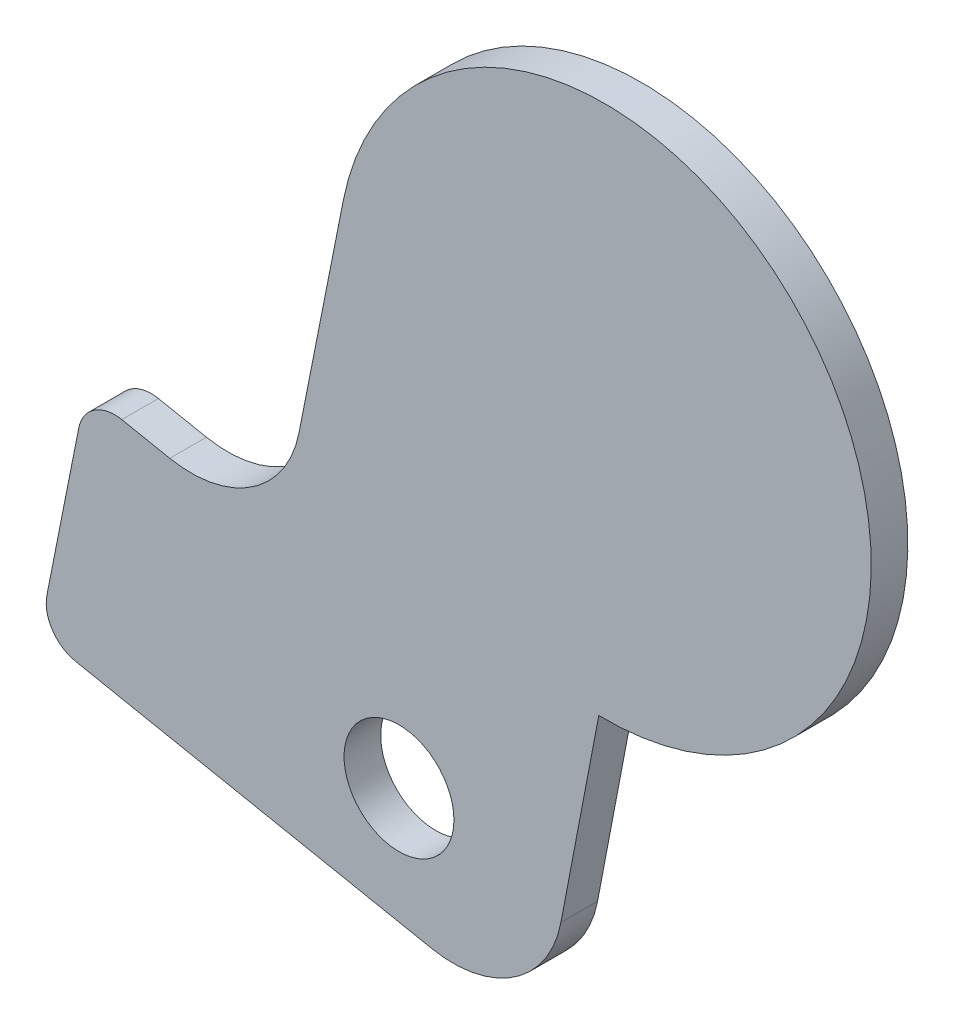
ISO-10303-21;
HEADER;
FILE_DESCRIPTION(('STEP AP214'),'2;1');
FILE_NAME('part.step','',(''),(''),'','','');
FILE_SCHEMA(('AUTOMOTIVE_DESIGN { 1 0 10303 214 1 1 1 1 }'));
ENDSEC;
DATA;
#1=APPLICATION_CONTEXT('core data for automotive mechanical design processes');
#2=APPLICATION_PROTOCOL_DEFINITION('international standard','automotive_design',2000,#1);
#3=PRODUCT_CONTEXT('',#1,'mechanical');
#4=PRODUCT('Part','Part','',(#3));
#5=PRODUCT_RELATED_PRODUCT_CATEGORY('part','',(#4));
#6=PRODUCT_DEFINITION_FORMATION('','',#4);
#7=PRODUCT_DEFINITION_CONTEXT('part definition',#1,'design');
#8=PRODUCT_DEFINITION('design','',#6,#7);
#9=PRODUCT_DEFINITION_SHAPE('','',#8);
#10=(LENGTH_UNIT() NAMED_UNIT(*) SI_UNIT(.MILLI.,.METRE.));
#11=(NAMED_UNIT(*) PLANE_ANGLE_UNIT() SI_UNIT($,.RADIAN.));
#12=(NAMED_UNIT(*) SI_UNIT($,.STERADIAN.) SOLID_ANGLE_UNIT());
#13=UNCERTAINTY_MEASURE_WITH_UNIT(LENGTH_MEASURE(1.E-05),#10,'distance_accuracy_value','');
#14=(GEOMETRIC_REPRESENTATION_CONTEXT(3) GLOBAL_UNCERTAINTY_ASSIGNED_CONTEXT((#13)) GLOBAL_UNIT_ASSIGNED_CONTEXT((#10,
#11,#12)) REPRESENTATION_CONTEXT('',''));
#15=CARTESIAN_POINT('',(0.,0.,0.));
#16=DIRECTION('',(0.,0.,1.));
#17=DIRECTION('',(1.,0.,0.));
#18=AXIS2_PLACEMENT_3D('',#15,#16,#17);
#19=CARTESIAN_POINT('',(-6.40771887772999,-0.302843388725544,1.));
#20=DIRECTION('',(0.,0.,1.));
#21=DIRECTION('',(1.,0.,0.));
#22=AXIS2_PLACEMENT_3D('',#19,#20,#21);
#23=PLANE('',#22);
#24=CARTESIAN_POINT('',(-6.40771887772999,-0.302843388725544,1.));
#25=DIRECTION('',(0.,0.,1.));
#26=DIRECTION('',(1.,0.,0.));
#27=AXIS2_PLACEMENT_3D('',#24,#25,#26);
#28=CIRCLE('',#27,7.27765728851541);
#29=CARTESIAN_POINT('',(-6.56956304573766,-7.57870086907543,1.));
#30=VERTEX_POINT('',#29);
#31=CARTESIAN_POINT('',(-13.5463885061971,1.11267473008585,1.));
#32=VERTEX_POINT('',#31);
#33=EDGE_CURVE('E159',#30,#32,#28,.T.);
#34=ORIENTED_EDGE('',*,*,#33,.T.);
#35=DIRECTION('',(-0.194501892943649,-0.980902142744799,0.));
#36=VECTOR('',#35,1.);
#37=CARTESIAN_POINT('',(-13.5463885061971,1.11267473008585,1.));
#38=LINE('',#37,#36);
#39=CARTESIAN_POINT('',(-14.7575259881664,-4.99527277234028,1.));
#40=VERTEX_POINT('',#39);
#41=EDGE_CURVE('E97',#32,#40,#38,.T.);
#42=ORIENTED_EDGE('',*,*,#41,.T.);
#43=CARTESIAN_POINT('',(-17.7002324164008,-4.41176709350935,1.));
#44=DIRECTION('',(0.,0.,-1.));
#45=DIRECTION('',(-1.,0.,0.));
#46=AXIS2_PLACEMENT_3D('',#43,#44,#45);
#47=CIRCLE('',#46,3.);
#48=CARTESIAN_POINT('',(-18.2837380952318,-7.35447352174374,1.));
#49=VERTEX_POINT('',#48);
#50=EDGE_CURVE('E180',#40,#49,#47,.T.);
#51=ORIENTED_EDGE('',*,*,#50,.T.);
#52=DIRECTION('',(-0.980902142744799,0.194501892943649,0.));
#53=VECTOR('',#52,1.);
#54=CARTESIAN_POINT('',(-18.2837380952318,-7.35447352174374,1.));
#55=LINE('',#54,#53);
#56=CARTESIAN_POINT('',(-19.5941240863566,-7.09463867721233,1.));
#57=VERTEX_POINT('',#56);
#58=EDGE_CURVE('E199',#49,#57,#55,.T.);
#59=ORIENTED_EDGE('',*,*,#58,.T.);
#60=CARTESIAN_POINT('',(-19.7886259793003,-8.07554081995713,1.));
#61=DIRECTION('',(0.,0.,1.));
#62=DIRECTION('',(1.,0.,0.));
#63=AXIS2_PLACEMENT_3D('',#60,#61,#62);
#64=CIRCLE('',#63,0.999999999999999);
#65=CARTESIAN_POINT('',(-20.7695281220451,-7.88103892701349,1.));
#66=VERTEX_POINT('',#65);
#67=EDGE_CURVE('E196',#57,#66,#64,.T.);
#68=ORIENTED_EDGE('',*,*,#67,.T.);
#69=DIRECTION('',(-0.194501892943649,-0.980902142744799,0.));
#70=VECTOR('',#69,1.);
#71=CARTESIAN_POINT('',(-20.7695281220451,-7.88103892701349,1.));
#72=LINE('',#71,#70);
#73=CARTESIAN_POINT('',(-21.6393560337717,-12.2677112082906,1.));
#74=VERTEX_POINT('',#73);
#75=EDGE_CURVE('E198',#66,#74,#72,.T.);
#76=ORIENTED_EDGE('',*,*,#75,.T.);
#77=CARTESIAN_POINT('',(-20.6584538910269,-12.4622131012343,1.));
#78=DIRECTION('',(0.,0.,1.));
#79=DIRECTION('',(1.,0.,0.));
#80=AXIS2_PLACEMENT_3D('',#77,#78,#79);
#81=CIRCLE('',#80,1.);
#82=CARTESIAN_POINT('',(-20.8529557839705,-13.4431152439791,1.));
#83=VERTEX_POINT('',#82);
#84=EDGE_CURVE('E122',#74,#83,#81,.T.);
#85=ORIENTED_EDGE('',*,*,#84,.T.);
#86=DIRECTION('',(0.980902142744799,-0.194501892943649,0.));
#87=VECTOR('',#86,1.);
#88=CARTESIAN_POINT('',(-20.8529557839705,-13.4431152439791,1.));
#89=LINE('',#88,#87);
#90=CARTESIAN_POINT('',(-11.1334701295303,-15.3703802338763,1.));
#91=VERTEX_POINT('',#90);
#92=EDGE_CURVE('E116',#83,#91,#89,.T.);
#93=ORIENTED_EDGE('',*,*,#92,.T.);
#94=CARTESIAN_POINT('',(-10.5499644506993,-12.4276738056419,1.));
#95=DIRECTION('',(0.,0.,1.));
#96=DIRECTION('',(1.,0.,0.));
#97=AXIS2_PLACEMENT_3D('',#94,#95,#96);
#98=CIRCLE('',#97,3.);
#99=CARTESIAN_POINT('',(-7.60323446962958,-12.9905080784653,1.));
#100=VERTEX_POINT('',#99);
#101=EDGE_CURVE('E120',#91,#100,#98,.T.);
#102=ORIENTED_EDGE('',*,*,#101,.T.);
#103=DIRECTION('',(0.187611424274465,0.982243327023252,0.));
#104=VECTOR('',#103,1.);
#105=CARTESIAN_POINT('',(-6.56956304573766,-7.57870086907543,1.));
#106=LINE('',#105,#104);
#107=EDGE_CURVE('E48',#100,#30,#106,.T.);
#108=ORIENTED_EDGE('',*,*,#107,.T.);
#109=EDGE_LOOP('',(#34,#42,#51,#59,#68,#76,#85,#93,#102,#108));
#110=FACE_BOUND('',#109,.T.);
#111=CARTESIAN_POINT('',(-12.0248336121557,-12.026666231992,1.));
#112=DIRECTION('',(0.,0.,1.));
#113=DIRECTION('',(1.,0.,0.));
#114=AXIS2_PLACEMENT_3D('',#111,#112,#113);
#115=CIRCLE('',#114,1.5);
#116=CARTESIAN_POINT('',(-10.5248336121557,-12.026666231992,1.));
#117=VERTEX_POINT('',#116);
#118=EDGE_CURVE('E144',#117,#117,#115,.T.);
#119=ORIENTED_EDGE('',*,*,#118,.F.);
#120=EDGE_LOOP('',(#119));
#121=FACE_BOUND('',#120,.T.);
#122=ADVANCED_FACE('F31',(#110,#121),#23,.T.);
#123=CARTESIAN_POINT('',(-6.40771887772999,-0.302843388725544,0.));
#124=DIRECTION('',(0.,0.,1.));
#125=DIRECTION('',(1.,0.,0.));
#126=AXIS2_PLACEMENT_3D('',#123,#124,#125);
#127=PLANE('',#126);
#128=CARTESIAN_POINT('',(-6.40771887772999,-0.302843388725544,0.));
#129=DIRECTION('',(0.,0.,1.));
#130=DIRECTION('',(1.,0.,0.));
#131=AXIS2_PLACEMENT_3D('',#128,#129,#130);
#132=CIRCLE('',#131,7.27765728851541);
#133=CARTESIAN_POINT('',(-6.56956304573766,-7.57870086907543,0.));
#134=VERTEX_POINT('',#133);
#135=CARTESIAN_POINT('',(-13.5463885061971,1.11267473008585,0.));
#136=VERTEX_POINT('',#135);
#137=EDGE_CURVE('E140',#134,#136,#132,.T.);
#138=ORIENTED_EDGE('',*,*,#137,.F.);
#139=DIRECTION('',(0.187611424274465,0.982243327023252,0.));
#140=VECTOR('',#139,1.);
#141=CARTESIAN_POINT('',(-6.56956304573766,-7.57870086907543,0.));
#142=LINE('',#141,#140);
#143=CARTESIAN_POINT('',(-7.60323446962958,-12.9905080784653,0.));
#144=VERTEX_POINT('',#143);
#145=EDGE_CURVE('E89',#144,#134,#142,.T.);
#146=ORIENTED_EDGE('',*,*,#145,.F.);
#147=CARTESIAN_POINT('',(-10.5499644506993,-12.4276738056419,0.));
#148=DIRECTION('',(0.,0.,1.));
#149=DIRECTION('',(1.,0.,0.));
#150=AXIS2_PLACEMENT_3D('',#147,#148,#149);
#151=CIRCLE('',#150,3.);
#152=CARTESIAN_POINT('',(-11.1334701295303,-15.3703802338763,0.));
#153=VERTEX_POINT('',#152);
#154=EDGE_CURVE('E83',#153,#144,#151,.T.);
#155=ORIENTED_EDGE('',*,*,#154,.F.);
#156=DIRECTION('',(0.980902142744799,-0.194501892943649,0.));
#157=VECTOR('',#156,1.);
#158=CARTESIAN_POINT('',(-20.8529557839705,-13.4431152439791,0.));
#159=LINE('',#158,#157);
#160=CARTESIAN_POINT('',(-20.8529557839705,-13.4431152439791,0.));
#161=VERTEX_POINT('',#160);
#162=EDGE_CURVE('E130',#161,#153,#159,.T.);
#163=ORIENTED_EDGE('',*,*,#162,.F.);
#164=CARTESIAN_POINT('',(-20.6584538910269,-12.4622131012343,0.));
#165=DIRECTION('',(0.,0.,1.));
#166=DIRECTION('',(1.,0.,0.));
#167=AXIS2_PLACEMENT_3D('',#164,#165,#166);
#168=CIRCLE('',#167,1.);
#169=CARTESIAN_POINT('',(-21.6393560337717,-12.2677112082906,0.));
#170=VERTEX_POINT('',#169);
#171=EDGE_CURVE('E154',#170,#161,#168,.T.);
#172=ORIENTED_EDGE('',*,*,#171,.F.);
#173=DIRECTION('',(-0.194501892943649,-0.980902142744799,0.));
#174=VECTOR('',#173,1.);
#175=CARTESIAN_POINT('',(-20.7695281220451,-7.88103892701349,0.));
#176=LINE('',#175,#174);
#177=CARTESIAN_POINT('',(-20.7695281220451,-7.88103892701349,0.));
#178=VERTEX_POINT('',#177);
#179=EDGE_CURVE('E152',#178,#170,#176,.T.);
#180=ORIENTED_EDGE('',*,*,#179,.F.);
#181=CARTESIAN_POINT('',(-19.7886259793003,-8.07554081995713,0.));
#182=DIRECTION('',(0.,0.,1.));
#183=DIRECTION('',(1.,0.,0.));
#184=AXIS2_PLACEMENT_3D('',#181,#182,#183);
#185=CIRCLE('',#184,0.999999999999999);
#186=CARTESIAN_POINT('',(-19.5941240863566,-7.09463867721233,0.));
#187=VERTEX_POINT('',#186);
#188=EDGE_CURVE('E150',#187,#178,#185,.T.);
#189=ORIENTED_EDGE('',*,*,#188,.F.);
#190=DIRECTION('',(-0.980902142744799,0.194501892943649,0.));
#191=VECTOR('',#190,1.);
#192=CARTESIAN_POINT('',(-18.2837380952318,-7.35447352174374,0.));
#193=LINE('',#192,#191);
#194=CARTESIAN_POINT('',(-18.2837380952318,-7.35447352174374,0.));
#195=VERTEX_POINT('',#194);
#196=EDGE_CURVE('E148',#195,#187,#193,.T.);
#197=ORIENTED_EDGE('',*,*,#196,.F.);
#198=CARTESIAN_POINT('',(-17.7002324164008,-4.41176709350935,0.));
#199=DIRECTION('',(0.,0.,-1.));
#200=DIRECTION('',(-1.,0.,0.));
#201=AXIS2_PLACEMENT_3D('',#198,#199,#200);
#202=CIRCLE('',#201,3.);
#203=CARTESIAN_POINT('',(-14.7575259881664,-4.99527277234028,0.));
#204=VERTEX_POINT('',#203);
#205=EDGE_CURVE('E146',#204,#195,#202,.T.);
#206=ORIENTED_EDGE('',*,*,#205,.F.);
#207=DIRECTION('',(-0.194501892943649,-0.980902142744799,0.));
#208=VECTOR('',#207,1.);
#209=CARTESIAN_POINT('',(-13.5463885061971,1.11267473008585,0.));
#210=LINE('',#209,#208);
#211=EDGE_CURVE('E143',#136,#204,#210,.T.);
#212=ORIENTED_EDGE('',*,*,#211,.F.);
#213=EDGE_LOOP('',(#138,#146,#155,#163,#172,#180,#189,#197,#206,#212));
#214=FACE_BOUND('',#213,.T.);
#215=CARTESIAN_POINT('',(-12.0248336121557,-12.026666231992,0.));
#216=DIRECTION('',(0.,0.,1.));
#217=DIRECTION('',(1.,0.,0.));
#218=AXIS2_PLACEMENT_3D('',#215,#216,#217);
#219=CIRCLE('',#218,1.5);
#220=CARTESIAN_POINT('',(-10.5248336121557,-12.026666231992,0.));
#221=VERTEX_POINT('',#220);
#222=EDGE_CURVE('E207',#221,#221,#219,.T.);
#223=ORIENTED_EDGE('',*,*,#222,.T.);
#224=EDGE_LOOP('',(#223));
#225=FACE_BOUND('',#224,.T.);
#226=ADVANCED_FACE('F184',(#214,#225),#127,.F.);
#227=CARTESIAN_POINT('',(-6.40771887772999,-0.302843388725544,1.));
#228=DIRECTION('',(0.,0.,-1.));
#229=DIRECTION('',(-1.,0.,0.));
#230=AXIS2_PLACEMENT_3D('',#227,#228,#229);
#231=CYLINDRICAL_SURFACE('',#230,7.27765728851541);
#232=ORIENTED_EDGE('',*,*,#137,.T.);
#233=DIRECTION('',(0.,0.,-1.));
#234=VECTOR('',#233,1.);
#235=CARTESIAN_POINT('',(-13.5463885061971,1.11267473008585,1.));
#236=LINE('',#235,#234);
#237=EDGE_CURVE('E11',#32,#136,#236,.T.);
#238=ORIENTED_EDGE('',*,*,#237,.F.);
#239=ORIENTED_EDGE('',*,*,#33,.F.);
#240=DIRECTION('',(0.,0.,-1.));
#241=VECTOR('',#240,1.);
#242=CARTESIAN_POINT('',(-6.56956304573766,-7.57870086907543,1.));
#243=LINE('',#242,#241);
#244=EDGE_CURVE('E136',#30,#134,#243,.T.);
#245=ORIENTED_EDGE('',*,*,#244,.T.);
#246=EDGE_LOOP('',(#232,#238,#239,#245));
#247=FACE_BOUND('',#246,.T.);
#248=ADVANCED_FACE('F33',(#247),#231,.T.);
#249=CARTESIAN_POINT('',(-13.5463885061971,1.11267473008585,1.));
#250=DIRECTION('',(0.980902142744799,-0.194501892943649,0.));
#251=DIRECTION('',(0.194501892943649,0.980902142744799,0.));
#252=AXIS2_PLACEMENT_3D('',#249,#250,#251);
#253=PLANE('',#252);
#254=ORIENTED_EDGE('',*,*,#211,.T.);
#255=DIRECTION('',(0.,0.,-1.));
#256=VECTOR('',#255,1.);
#257=CARTESIAN_POINT('',(-14.7575259881664,-4.99527277234028,1.));
#258=LINE('',#257,#256);
#259=EDGE_CURVE('E40',#40,#204,#258,.T.);
#260=ORIENTED_EDGE('',*,*,#259,.F.);
#261=ORIENTED_EDGE('',*,*,#41,.F.);
#262=ORIENTED_EDGE('',*,*,#237,.T.);
#263=EDGE_LOOP('',(#254,#260,#261,#262));
#264=FACE_BOUND('',#263,.T.);
#265=ADVANCED_FACE('F243',(#264),#253,.F.);
#266=CARTESIAN_POINT('',(-17.7002324164008,-4.41176709350935,1.));
#267=DIRECTION('',(0.,0.,-1.));
#268=DIRECTION('',(-1.,0.,0.));
#269=AXIS2_PLACEMENT_3D('',#266,#267,#268);
#270=CYLINDRICAL_SURFACE('',#269,3.);
#271=ORIENTED_EDGE('',*,*,#205,.T.);
#272=DIRECTION('',(0.,0.,-1.));
#273=VECTOR('',#272,1.);
#274=CARTESIAN_POINT('',(-18.2837380952318,-7.35447352174374,1.));
#275=LINE('',#274,#273);
#276=EDGE_CURVE('E172',#49,#195,#275,.T.);
#277=ORIENTED_EDGE('',*,*,#276,.F.);
#278=ORIENTED_EDGE('',*,*,#50,.F.);
#279=ORIENTED_EDGE('',*,*,#259,.T.);
#280=EDGE_LOOP('',(#271,#277,#278,#279));
#281=FACE_BOUND('',#280,.T.);
#282=ADVANCED_FACE('F178',(#281),#270,.F.);
#283=CARTESIAN_POINT('',(-18.2837380952318,-7.35447352174374,1.));
#284=DIRECTION('',(-0.194501892943649,-0.980902142744799,0.));
#285=DIRECTION('',(0.980902142744799,-0.194501892943649,0.));
#286=AXIS2_PLACEMENT_3D('',#283,#284,#285);
#287=PLANE('',#286);
#288=ORIENTED_EDGE('',*,*,#196,.T.);
#289=DIRECTION('',(0.,0.,-1.));
#290=VECTOR('',#289,1.);
#291=CARTESIAN_POINT('',(-19.5941240863566,-7.09463867721233,1.));
#292=LINE('',#291,#290);
#293=EDGE_CURVE('E169',#57,#187,#292,.T.);
#294=ORIENTED_EDGE('',*,*,#293,.F.);
#295=ORIENTED_EDGE('',*,*,#58,.F.);
#296=ORIENTED_EDGE('',*,*,#276,.T.);
#297=EDGE_LOOP('',(#288,#294,#295,#296));
#298=FACE_BOUND('',#297,.T.);
#299=ADVANCED_FACE('F190',(#298),#287,.F.);
#300=CARTESIAN_POINT('',(-19.7886259793003,-8.07554081995713,1.));
#301=DIRECTION('',(0.,0.,-1.));
#302=DIRECTION('',(-1.,0.,0.));
#303=AXIS2_PLACEMENT_3D('',#300,#301,#302);
#304=CYLINDRICAL_SURFACE('',#303,0.999999999999999);
#305=ORIENTED_EDGE('',*,*,#188,.T.);
#306=DIRECTION('',(0.,0.,-1.));
#307=VECTOR('',#306,1.);
#308=CARTESIAN_POINT('',(-20.7695281220451,-7.88103892701349,1.));
#309=LINE('',#308,#307);
#310=EDGE_CURVE('E166',#66,#178,#309,.T.);
#311=ORIENTED_EDGE('',*,*,#310,.F.);
#312=ORIENTED_EDGE('',*,*,#67,.F.);
#313=ORIENTED_EDGE('',*,*,#293,.T.);
#314=EDGE_LOOP('',(#305,#311,#312,#313));
#315=FACE_BOUND('',#314,.T.);
#316=ADVANCED_FACE('F194',(#315),#304,.T.);
#317=CARTESIAN_POINT('',(-20.7695281220451,-7.88103892701349,1.));
#318=DIRECTION('',(0.980902142744799,-0.194501892943649,0.));
#319=DIRECTION('',(0.194501892943649,0.980902142744799,0.));
#320=AXIS2_PLACEMENT_3D('',#317,#318,#319);
#321=PLANE('',#320);
#322=ORIENTED_EDGE('',*,*,#179,.T.);
#323=DIRECTION('',(0.,0.,-1.));
#324=VECTOR('',#323,1.);
#325=CARTESIAN_POINT('',(-21.6393560337717,-12.2677112082906,1.));
#326=LINE('',#325,#324);
#327=EDGE_CURVE('E163',#74,#170,#326,.T.);
#328=ORIENTED_EDGE('',*,*,#327,.F.);
#329=ORIENTED_EDGE('',*,*,#75,.F.);
#330=ORIENTED_EDGE('',*,*,#310,.T.);
#331=EDGE_LOOP('',(#322,#328,#329,#330));
#332=FACE_BOUND('',#331,.T.);
#333=ADVANCED_FACE('F233',(#332),#321,.F.);
#334=CARTESIAN_POINT('',(-20.6584538910269,-12.4622131012343,1.));
#335=DIRECTION('',(0.,0.,-1.));
#336=DIRECTION('',(-1.,0.,0.));
#337=AXIS2_PLACEMENT_3D('',#334,#335,#336);
#338=CYLINDRICAL_SURFACE('',#337,1.);
#339=ORIENTED_EDGE('',*,*,#171,.T.);
#340=DIRECTION('',(0.,0.,-1.));
#341=VECTOR('',#340,1.);
#342=CARTESIAN_POINT('',(-20.8529557839705,-13.4431152439791,1.));
#343=LINE('',#342,#341);
#344=EDGE_CURVE('E131',#83,#161,#343,.T.);
#345=ORIENTED_EDGE('',*,*,#344,.F.);
#346=ORIENTED_EDGE('',*,*,#84,.F.);
#347=ORIENTED_EDGE('',*,*,#327,.T.);
#348=EDGE_LOOP('',(#339,#345,#346,#347));
#349=FACE_BOUND('',#348,.T.);
#350=ADVANCED_FACE('F230',(#349),#338,.T.);
#351=CARTESIAN_POINT('',(-20.8529557839705,-13.4431152439791,1.));
#352=DIRECTION('',(0.194501892943649,0.980902142744799,0.));
#353=DIRECTION('',(-0.980902142744799,0.194501892943649,0.));
#354=AXIS2_PLACEMENT_3D('',#351,#352,#353);
#355=PLANE('',#354);
#356=ORIENTED_EDGE('',*,*,#162,.T.);
#357=DIRECTION('',(0.,0.,-1.));
#358=VECTOR('',#357,1.);
#359=CARTESIAN_POINT('',(-11.1334701295303,-15.3703802338763,1.));
#360=LINE('',#359,#358);
#361=EDGE_CURVE('E127',#91,#153,#360,.T.);
#362=ORIENTED_EDGE('',*,*,#361,.F.);
#363=ORIENTED_EDGE('',*,*,#92,.F.);
#364=ORIENTED_EDGE('',*,*,#344,.T.);
#365=EDGE_LOOP('',(#356,#362,#363,#364));
#366=FACE_BOUND('',#365,.T.);
#367=ADVANCED_FACE('F128',(#366),#355,.F.);
#368=CARTESIAN_POINT('',(-10.5499644506993,-12.4276738056419,1.));
#369=DIRECTION('',(0.,0.,-1.));
#370=DIRECTION('',(-1.,0.,0.));
#371=AXIS2_PLACEMENT_3D('',#368,#369,#370);
#372=CYLINDRICAL_SURFACE('',#371,3.);
#373=ORIENTED_EDGE('',*,*,#154,.T.);
#374=DIRECTION('',(0.,0.,-1.));
#375=VECTOR('',#374,1.);
#376=CARTESIAN_POINT('',(-7.60323446962958,-12.9905080784653,1.));
#377=LINE('',#376,#375);
#378=EDGE_CURVE('E132',#100,#144,#377,.T.);
#379=ORIENTED_EDGE('',*,*,#378,.F.);
#380=ORIENTED_EDGE('',*,*,#101,.F.);
#381=ORIENTED_EDGE('',*,*,#361,.T.);
#382=EDGE_LOOP('',(#373,#379,#380,#381));
#383=FACE_BOUND('',#382,.T.);
#384=ADVANCED_FACE('F134',(#383),#372,.T.);
#385=CARTESIAN_POINT('',(-6.56956304573766,-7.57870086907543,1.));
#386=DIRECTION('',(-0.982243327023252,0.187611424274465,0.));
#387=DIRECTION('',(-0.187611424274465,-0.982243327023252,0.));
#388=AXIS2_PLACEMENT_3D('',#385,#386,#387);
#389=PLANE('',#388);
#390=ORIENTED_EDGE('',*,*,#145,.T.);
#391=ORIENTED_EDGE('',*,*,#244,.F.);
#392=ORIENTED_EDGE('',*,*,#107,.F.);
#393=ORIENTED_EDGE('',*,*,#378,.T.);
#394=EDGE_LOOP('',(#390,#391,#392,#393));
#395=FACE_BOUND('',#394,.T.);
#396=ADVANCED_FACE('F223',(#395),#389,.F.);
#397=CARTESIAN_POINT('',(-12.0248336121557,-12.026666231992,1.));
#398=DIRECTION('',(0.,0.,-1.));
#399=DIRECTION('',(-1.,0.,0.));
#400=AXIS2_PLACEMENT_3D('',#397,#398,#399);
#401=CYLINDRICAL_SURFACE('',#400,1.5);
#402=ORIENTED_EDGE('',*,*,#118,.T.);
#403=EDGE_LOOP('',(#402));
#404=FACE_BOUND('',#403,.T.);
#405=ORIENTED_EDGE('',*,*,#222,.F.);
#406=EDGE_LOOP('',(#405));
#407=FACE_BOUND('',#406,.T.);
#408=ADVANCED_FACE('F213',(#404,#407),#401,.F.);
#409=CLOSED_SHELL('',(#122,#226,#248,#265,#282,#299,#316,#333,#350,#367,#384,#396,#408));
#410=MANIFOLD_SOLID_BREP('B2',#409);
#411=ADVANCED_BREP_SHAPE_REPRESENTATION('',(#18,#410),#14);
#412=SHAPE_DEFINITION_REPRESENTATION(#9,#411);
ENDSEC;
END-ISO-10303-21;
